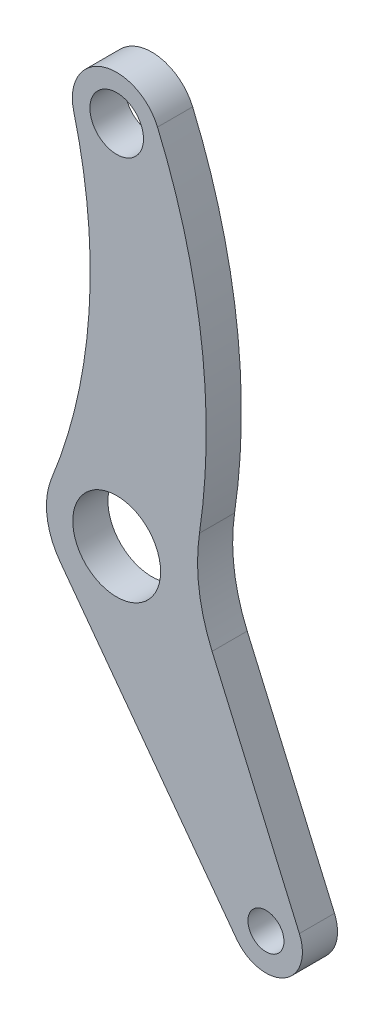
ISO-10303-21;
HEADER;
FILE_DESCRIPTION(('STEP AP214'),'2;1');
FILE_NAME('part.step','',(''),(''),'','','');
FILE_SCHEMA(('AUTOMOTIVE_DESIGN { 1 0 10303 214 1 1 1 1 }'));
ENDSEC;
DATA;
#1=APPLICATION_CONTEXT('core data for automotive mechanical design processes');
#2=APPLICATION_PROTOCOL_DEFINITION('international standard','automotive_design',2000,#1);
#3=PRODUCT_CONTEXT('',#1,'mechanical');
#4=PRODUCT('Part','Part','',(#3));
#5=PRODUCT_RELATED_PRODUCT_CATEGORY('part','',(#4));
#6=PRODUCT_DEFINITION_FORMATION('','',#4);
#7=PRODUCT_DEFINITION_CONTEXT('part definition',#1,'design');
#8=PRODUCT_DEFINITION('design','',#6,#7);
#9=PRODUCT_DEFINITION_SHAPE('','',#8);
#10=(LENGTH_UNIT() NAMED_UNIT(*) SI_UNIT(.MILLI.,.METRE.));
#11=(NAMED_UNIT(*) PLANE_ANGLE_UNIT() SI_UNIT($,.RADIAN.));
#12=(NAMED_UNIT(*) SI_UNIT($,.STERADIAN.) SOLID_ANGLE_UNIT());
#13=UNCERTAINTY_MEASURE_WITH_UNIT(LENGTH_MEASURE(1.E-05),#10,'distance_accuracy_value','');
#14=(GEOMETRIC_REPRESENTATION_CONTEXT(3) GLOBAL_UNCERTAINTY_ASSIGNED_CONTEXT((#13)) GLOBAL_UNIT_ASSIGNED_CONTEXT((#10,
#11,#12)) REPRESENTATION_CONTEXT('',''));
#15=CARTESIAN_POINT('',(0.,0.,0.));
#16=DIRECTION('',(0.,0.,1.));
#17=DIRECTION('',(1.,0.,0.));
#18=AXIS2_PLACEMENT_3D('',#15,#16,#17);
#19=CARTESIAN_POINT('',(0.,20.85,2.));
#20=DIRECTION('',(0.,0.,-1.));
#21=DIRECTION('',(-1.,0.,0.));
#22=AXIS2_PLACEMENT_3D('',#19,#20,#21);
#23=CYLINDRICAL_SURFACE('',#22,2.525);
#24=DIRECTION('',(0.,0.,1.));
#25=VECTOR('',#24,1.);
#26=CARTESIAN_POINT('',(2.32489384665101,21.8351363366582,-23.4515533866941));
#27=LINE('',#26,#25);
#28=CARTESIAN_POINT('',(2.32489384665101,21.8351363366582,0.));
#29=VERTEX_POINT('',#28);
#30=CARTESIAN_POINT('',(2.32489384665101,21.8351363366582,2.));
#31=VERTEX_POINT('',#30);
#32=EDGE_CURVE('E127',#29,#31,#27,.T.);
#33=ORIENTED_EDGE('',*,*,#32,.F.);
#34=CARTESIAN_POINT('',(0.,20.85,0.));
#35=DIRECTION('',(0.,0.,1.));
#36=DIRECTION('',(1.,0.,0.));
#37=AXIS2_PLACEMENT_3D('',#34,#35,#36);
#38=CIRCLE('',#37,2.525);
#39=CARTESIAN_POINT('',(-2.44600580844733,20.223357689713,0.));
#40=VERTEX_POINT('',#39);
#41=EDGE_CURVE('E116',#29,#40,#38,.T.);
#42=ORIENTED_EDGE('',*,*,#41,.T.);
#43=DIRECTION('',(0.,0.,1.));
#44=VECTOR('',#43,1.);
#45=CARTESIAN_POINT('',(-2.44600580844733,20.223357689713,-8.));
#46=LINE('',#45,#44);
#47=CARTESIAN_POINT('',(-2.44600580844733,20.223357689713,2.));
#48=VERTEX_POINT('',#47);
#49=EDGE_CURVE('E114',#40,#48,#46,.T.);
#50=ORIENTED_EDGE('',*,*,#49,.T.);
#51=CARTESIAN_POINT('',(0.,20.85,2.));
#52=DIRECTION('',(0.,0.,1.));
#53=DIRECTION('',(1.,0.,0.));
#54=AXIS2_PLACEMENT_3D('',#51,#52,#53);
#55=CIRCLE('',#54,2.525);
#56=EDGE_CURVE('E101',#31,#48,#55,.T.);
#57=ORIENTED_EDGE('',*,*,#56,.F.);
#58=EDGE_LOOP('',(#33,#42,#50,#57));
#59=FACE_BOUND('',#58,.T.);
#60=ADVANCED_FACE('F38',(#59),#23,.T.);
#61=CARTESIAN_POINT('',(0.,20.85,2.));
#62=DIRECTION('',(0.,0.,1.));
#63=DIRECTION('',(1.,0.,0.));
#64=AXIS2_PLACEMENT_3D('',#61,#62,#63);
#65=PLANE('',#64);
#66=DIRECTION('',(-0.398719458718008,0.917072948701257,0.));
#67=VECTOR('',#66,1.);
#68=CARTESIAN_POINT('',(3.94150323251723,0.966479061440609,2.));
#69=LINE('',#68,#67);
#70=CARTESIAN_POINT('',(10.402926368555,-13.8950889874956,2.));
#71=VERTEX_POINT('',#70);
#72=CARTESIAN_POINT('',(5.43288855448548,-2.46377523130135,2.));
#73=VERTEX_POINT('',#72);
#74=EDGE_CURVE('E156',#71,#73,#69,.T.);
#75=ORIENTED_EDGE('',*,*,#74,.T.);
#76=CARTESIAN_POINT('',(14.6036180414981,1.52341935587873,2.));
#77=DIRECTION('',(0.,0.,1.));
#78=DIRECTION('',(1.,0.,0.));
#79=AXIS2_PLACEMENT_3D('',#76,#77,#78);
#80=CIRCLE('',#79,10.);
#81=CARTESIAN_POINT('',(4.7136234782616,3.00261087125234,2.));
#82=VERTEX_POINT('',#81);
#83=EDGE_CURVE('E46',#73,#82,#80,.F.);
#84=ORIENTED_EDGE('',*,*,#83,.T.);
#85=CARTESIAN_POINT('',(-29.901357493066,8.17978117505995,2.));
#86=DIRECTION('',(0.,0.,1.));
#87=DIRECTION('',(-1.,0.,0.));
#88=AXIS2_PLACEMENT_3D('',#85,#86,#87);
#89=CIRCLE('',#88,35.);
#90=EDGE_CURVE('E107',#82,#31,#89,.T.);
#91=ORIENTED_EDGE('',*,*,#90,.T.);
#92=ORIENTED_EDGE('',*,*,#56,.T.);
#93=CARTESIAN_POINT('',(-31.5074609583167,12.7781025179856,2.));
#94=DIRECTION('',(0.,0.,1.));
#95=DIRECTION('',(-1.,0.,0.));
#96=AXIS2_PLACEMENT_3D('',#93,#94,#95);
#97=CIRCLE('',#96,30.);
#98=CARTESIAN_POINT('',(-3.70676011274314,1.50330617858654,2.));
#99=VERTEX_POINT('',#98);
#100=EDGE_CURVE('E106',#99,#48,#97,.T.);
#101=ORIENTED_EDGE('',*,*,#100,.F.);
#102=CARTESIAN_POINT('',(0.,0.,2.));
#103=DIRECTION('',(0.,0.,1.));
#104=DIRECTION('',(1.,0.,0.));
#105=AXIS2_PLACEMENT_3D('',#102,#103,#104);
#106=CIRCLE('',#105,4.);
#107=CARTESIAN_POINT('',(-3.21535061833445,-2.37939496535911,2.));
#108=VERTEX_POINT('',#107);
#109=EDGE_CURVE('E110',#99,#108,#106,.T.);
#110=ORIENTED_EDGE('',*,*,#109,.T.);
#111=DIRECTION('',(0.594848741339779,-0.803837654583611,0.));
#112=VECTOR('',#111,1.);
#113=CARTESIAN_POINT('',(-3.21535061833445,-2.37939496535911,2.));
#114=LINE('',#113,#112);
#115=CARTESIAN_POINT('',(6.83203686673892,-15.9567430026155,2.));
#116=VERTEX_POINT('',#115);
#117=EDGE_CURVE('E152',#108,#116,#114,.T.);
#118=ORIENTED_EDGE('',*,*,#117,.T.);
#119=CARTESIAN_POINT('',(8.49999999999991,-14.7224318643355,2.));
#120=DIRECTION('',(0.,0.,1.));
#121=DIRECTION('',(1.,0.,0.));
#122=AXIS2_PLACEMENT_3D('',#119,#120,#121);
#123=CIRCLE('',#122,2.075);
#124=EDGE_CURVE('E154',#116,#71,#123,.T.);
#125=ORIENTED_EDGE('',*,*,#124,.T.);
#126=EDGE_LOOP('',(#75,#84,#91,#92,#101,#110,#118,#125));
#127=FACE_BOUND('',#126,.T.);
#128=CARTESIAN_POINT('',(8.49999999999991,-14.7224318643355,2.));
#129=DIRECTION('',(0.,0.,1.));
#130=DIRECTION('',(1.,0.,0.));
#131=AXIS2_PLACEMENT_3D('',#128,#129,#130);
#132=CIRCLE('',#131,1.025);
#133=CARTESIAN_POINT('',(9.52499999999992,-14.7224318643355,2.));
#134=VERTEX_POINT('',#133);
#135=EDGE_CURVE('E140',#134,#134,#132,.T.);
#136=ORIENTED_EDGE('',*,*,#135,.F.);
#137=EDGE_LOOP('',(#136));
#138=FACE_BOUND('',#137,.T.);
#139=CARTESIAN_POINT('',(0.,20.85,2.));
#140=DIRECTION('',(0.,0.,1.));
#141=DIRECTION('',(1.,0.,0.));
#142=AXIS2_PLACEMENT_3D('',#139,#140,#141);
#143=CIRCLE('',#142,1.525);
#144=CARTESIAN_POINT('',(1.525,20.85,2.));
#145=VERTEX_POINT('',#144);
#146=EDGE_CURVE('E146',#145,#145,#143,.T.);
#147=ORIENTED_EDGE('',*,*,#146,.F.);
#148=EDGE_LOOP('',(#147));
#149=FACE_BOUND('',#148,.T.);
#150=CARTESIAN_POINT('',(0.,0.,2.));
#151=DIRECTION('',(0.,0.,1.));
#152=DIRECTION('',(1.,0.,0.));
#153=AXIS2_PLACEMENT_3D('',#150,#151,#152);
#154=CIRCLE('',#153,2.5);
#155=CARTESIAN_POINT('',(2.5,0.,2.));
#156=VERTEX_POINT('',#155);
#157=EDGE_CURVE('E134',#156,#156,#154,.T.);
#158=ORIENTED_EDGE('',*,*,#157,.F.);
#159=EDGE_LOOP('',(#158));
#160=FACE_BOUND('',#159,.T.);
#161=ADVANCED_FACE('F103',(#127,#138,#149,#160),#65,.T.);
#162=CARTESIAN_POINT('',(0.,20.85,0.));
#163=DIRECTION('',(0.,0.,1.));
#164=DIRECTION('',(1.,0.,0.));
#165=AXIS2_PLACEMENT_3D('',#162,#163,#164);
#166=PLANE('',#165);
#167=CARTESIAN_POINT('',(-29.901357493066,8.17978117505995,0.));
#168=DIRECTION('',(0.,0.,1.));
#169=DIRECTION('',(1.,0.,0.));
#170=AXIS2_PLACEMENT_3D('',#167,#168,#169);
#171=CIRCLE('',#170,35.);
#172=CARTESIAN_POINT('',(4.7136234782616,3.00261087125234,0.));
#173=VERTEX_POINT('',#172);
#174=EDGE_CURVE('E125',#29,#173,#171,.F.);
#175=ORIENTED_EDGE('',*,*,#174,.T.);
#176=CARTESIAN_POINT('',(14.6036180414981,1.52341935587873,0.));
#177=DIRECTION('',(0.,0.,1.));
#178=DIRECTION('',(1.,0.,0.));
#179=AXIS2_PLACEMENT_3D('',#176,#177,#178);
#180=CIRCLE('',#179,10.);
#181=CARTESIAN_POINT('',(5.43288855448548,-2.46377523130135,0.));
#182=VERTEX_POINT('',#181);
#183=EDGE_CURVE('E11',#173,#182,#180,.T.);
#184=ORIENTED_EDGE('',*,*,#183,.T.);
#185=DIRECTION('',(-0.398719458718008,0.917072948701257,0.));
#186=VECTOR('',#185,1.);
#187=CARTESIAN_POINT('',(3.94150323251723,0.966479061440609,0.));
#188=LINE('',#187,#186);
#189=CARTESIAN_POINT('',(10.402926368555,-13.8950889874956,0.));
#190=VERTEX_POINT('',#189);
#191=EDGE_CURVE('E111',#190,#182,#188,.T.);
#192=ORIENTED_EDGE('',*,*,#191,.F.);
#193=CARTESIAN_POINT('',(8.49999999999991,-14.7224318643355,0.));
#194=DIRECTION('',(0.,0.,1.));
#195=DIRECTION('',(1.,0.,0.));
#196=AXIS2_PLACEMENT_3D('',#193,#194,#195);
#197=CIRCLE('',#196,2.075);
#198=CARTESIAN_POINT('',(6.83203686673892,-15.9567430026155,0.));
#199=VERTEX_POINT('',#198);
#200=EDGE_CURVE('E164',#199,#190,#197,.T.);
#201=ORIENTED_EDGE('',*,*,#200,.F.);
#202=DIRECTION('',(0.594848741339779,-0.803837654583611,0.));
#203=VECTOR('',#202,1.);
#204=CARTESIAN_POINT('',(-3.21535061833445,-2.37939496535911,0.));
#205=LINE('',#204,#203);
#206=CARTESIAN_POINT('',(-3.21535061833445,-2.37939496535911,0.));
#207=VERTEX_POINT('',#206);
#208=EDGE_CURVE('E162',#207,#199,#205,.T.);
#209=ORIENTED_EDGE('',*,*,#208,.F.);
#210=CARTESIAN_POINT('',(0.,0.,0.));
#211=DIRECTION('',(0.,0.,1.));
#212=DIRECTION('',(1.,0.,0.));
#213=AXIS2_PLACEMENT_3D('',#210,#211,#212);
#214=CIRCLE('',#213,4.);
#215=CARTESIAN_POINT('',(-3.70676011274314,1.50330617858654,0.));
#216=VERTEX_POINT('',#215);
#217=EDGE_CURVE('E160',#216,#207,#214,.T.);
#218=ORIENTED_EDGE('',*,*,#217,.F.);
#219=CARTESIAN_POINT('',(-31.5074609583167,12.7781025179856,0.));
#220=DIRECTION('',(0.,0.,1.));
#221=DIRECTION('',(1.,0.,0.));
#222=AXIS2_PLACEMENT_3D('',#219,#220,#221);
#223=CIRCLE('',#222,30.);
#224=EDGE_CURVE('E176',#216,#40,#223,.T.);
#225=ORIENTED_EDGE('',*,*,#224,.T.);
#226=ORIENTED_EDGE('',*,*,#41,.F.);
#227=EDGE_LOOP('',(#175,#184,#192,#201,#209,#218,#225,#226));
#228=FACE_BOUND('',#227,.T.);
#229=CARTESIAN_POINT('',(0.,20.85,0.));
#230=DIRECTION('',(0.,0.,1.));
#231=DIRECTION('',(1.,0.,0.));
#232=AXIS2_PLACEMENT_3D('',#229,#230,#231);
#233=CIRCLE('',#232,1.525);
#234=CARTESIAN_POINT('',(1.525,20.85,0.));
#235=VERTEX_POINT('',#234);
#236=EDGE_CURVE('E143',#235,#235,#233,.T.);
#237=ORIENTED_EDGE('',*,*,#236,.T.);
#238=EDGE_LOOP('',(#237));
#239=FACE_BOUND('',#238,.T.);
#240=CARTESIAN_POINT('',(8.49999999999991,-14.7224318643355,0.));
#241=DIRECTION('',(0.,0.,1.));
#242=DIRECTION('',(1.,0.,0.));
#243=AXIS2_PLACEMENT_3D('',#240,#241,#242);
#244=CIRCLE('',#243,1.025);
#245=CARTESIAN_POINT('',(9.52499999999992,-14.7224318643355,0.));
#246=VERTEX_POINT('',#245);
#247=EDGE_CURVE('E137',#246,#246,#244,.T.);
#248=ORIENTED_EDGE('',*,*,#247,.T.);
#249=EDGE_LOOP('',(#248));
#250=FACE_BOUND('',#249,.T.);
#251=CARTESIAN_POINT('',(0.,0.,0.));
#252=DIRECTION('',(0.,0.,1.));
#253=DIRECTION('',(1.,0.,0.));
#254=AXIS2_PLACEMENT_3D('',#251,#252,#253);
#255=CIRCLE('',#254,2.5);
#256=CARTESIAN_POINT('',(2.5,0.,0.));
#257=VERTEX_POINT('',#256);
#258=EDGE_CURVE('E132',#257,#257,#255,.T.);
#259=ORIENTED_EDGE('',*,*,#258,.T.);
#260=EDGE_LOOP('',(#259));
#261=FACE_BOUND('',#260,.T.);
#262=ADVANCED_FACE('F196',(#228,#239,#250,#261),#166,.F.);
#263=CARTESIAN_POINT('',(0.,0.,2.));
#264=DIRECTION('',(0.,0.,-1.));
#265=DIRECTION('',(-1.,0.,0.));
#266=AXIS2_PLACEMENT_3D('',#263,#264,#265);
#267=CYLINDRICAL_SURFACE('',#266,4.);
#268=ORIENTED_EDGE('',*,*,#217,.T.);
#269=DIRECTION('',(0.,0.,-1.));
#270=VECTOR('',#269,1.);
#271=CARTESIAN_POINT('',(-3.21535061833445,-2.37939496535911,2.));
#272=LINE('',#271,#270);
#273=EDGE_CURVE('E173',#108,#207,#272,.T.);
#274=ORIENTED_EDGE('',*,*,#273,.F.);
#275=ORIENTED_EDGE('',*,*,#109,.F.);
#276=DIRECTION('',(0.,0.,1.));
#277=VECTOR('',#276,1.);
#278=CARTESIAN_POINT('',(-3.70676011274314,1.50330617858654,-8.));
#279=LINE('',#278,#277);
#280=EDGE_CURVE('E120',#216,#99,#279,.T.);
#281=ORIENTED_EDGE('',*,*,#280,.F.);
#282=EDGE_LOOP('',(#268,#274,#275,#281));
#283=FACE_BOUND('',#282,.T.);
#284=ADVANCED_FACE('F211',(#283),#267,.T.);
#285=CARTESIAN_POINT('',(-3.21535061833445,-2.37939496535911,2.));
#286=DIRECTION('',(0.803837654583611,0.594848741339779,0.));
#287=DIRECTION('',(-0.594848741339779,0.803837654583611,0.));
#288=AXIS2_PLACEMENT_3D('',#285,#286,#287);
#289=PLANE('',#288);
#290=ORIENTED_EDGE('',*,*,#208,.T.);
#291=DIRECTION('',(0.,0.,-1.));
#292=VECTOR('',#291,1.);
#293=CARTESIAN_POINT('',(6.83203686673892,-15.9567430026155,2.));
#294=LINE('',#293,#292);
#295=EDGE_CURVE('E170',#116,#199,#294,.T.);
#296=ORIENTED_EDGE('',*,*,#295,.F.);
#297=ORIENTED_EDGE('',*,*,#117,.F.);
#298=ORIENTED_EDGE('',*,*,#273,.T.);
#299=EDGE_LOOP('',(#290,#296,#297,#298));
#300=FACE_BOUND('',#299,.T.);
#301=ADVANCED_FACE('F214',(#300),#289,.F.);
#302=CARTESIAN_POINT('',(8.49999999999991,-14.7224318643355,2.));
#303=DIRECTION('',(0.,0.,-1.));
#304=DIRECTION('',(-1.,0.,0.));
#305=AXIS2_PLACEMENT_3D('',#302,#303,#304);
#306=CYLINDRICAL_SURFACE('',#305,2.075);
#307=ORIENTED_EDGE('',*,*,#200,.T.);
#308=DIRECTION('',(0.,0.,-1.));
#309=VECTOR('',#308,1.);
#310=CARTESIAN_POINT('',(10.402926368555,-13.8950889874956,2.));
#311=LINE('',#310,#309);
#312=EDGE_CURVE('E158',#71,#190,#311,.T.);
#313=ORIENTED_EDGE('',*,*,#312,.F.);
#314=ORIENTED_EDGE('',*,*,#124,.F.);
#315=ORIENTED_EDGE('',*,*,#295,.T.);
#316=EDGE_LOOP('',(#307,#313,#314,#315));
#317=FACE_BOUND('',#316,.T.);
#318=ADVANCED_FACE('F193',(#317),#306,.T.);
#319=CARTESIAN_POINT('',(3.94150323251723,0.966479061440609,2.));
#320=DIRECTION('',(-0.917072948701257,-0.398719458718008,0.));
#321=DIRECTION('',(0.398719458718008,-0.917072948701257,0.));
#322=AXIS2_PLACEMENT_3D('',#319,#320,#321);
#323=PLANE('',#322);
#324=ORIENTED_EDGE('',*,*,#191,.T.);
#325=DIRECTION('',(0.,0.,1.));
#326=VECTOR('',#325,1.);
#327=CARTESIAN_POINT('',(5.43288855448548,-2.46377523130135,2.));
#328=LINE('',#327,#326);
#329=EDGE_CURVE('E178',#182,#73,#328,.T.);
#330=ORIENTED_EDGE('',*,*,#329,.T.);
#331=ORIENTED_EDGE('',*,*,#74,.F.);
#332=ORIENTED_EDGE('',*,*,#312,.T.);
#333=EDGE_LOOP('',(#324,#330,#331,#332));
#334=FACE_BOUND('',#333,.T.);
#335=ADVANCED_FACE('F184',(#334),#323,.F.);
#336=CARTESIAN_POINT('',(0.,20.85,2.));
#337=DIRECTION('',(0.,0.,-1.));
#338=DIRECTION('',(-1.,0.,0.));
#339=AXIS2_PLACEMENT_3D('',#336,#337,#338);
#340=CYLINDRICAL_SURFACE('',#339,1.525);
#341=ORIENTED_EDGE('',*,*,#146,.T.);
#342=EDGE_LOOP('',(#341));
#343=FACE_BOUND('',#342,.T.);
#344=ORIENTED_EDGE('',*,*,#236,.F.);
#345=EDGE_LOOP('',(#344));
#346=FACE_BOUND('',#345,.T.);
#347=ADVANCED_FACE('F223',(#343,#346),#340,.F.);
#348=CARTESIAN_POINT('',(8.49999999999991,-14.7224318643355,2.));
#349=DIRECTION('',(0.,0.,-1.));
#350=DIRECTION('',(-1.,0.,0.));
#351=AXIS2_PLACEMENT_3D('',#348,#349,#350);
#352=CYLINDRICAL_SURFACE('',#351,1.025);
#353=ORIENTED_EDGE('',*,*,#135,.T.);
#354=EDGE_LOOP('',(#353));
#355=FACE_BOUND('',#354,.T.);
#356=ORIENTED_EDGE('',*,*,#247,.F.);
#357=EDGE_LOOP('',(#356));
#358=FACE_BOUND('',#357,.T.);
#359=ADVANCED_FACE('F228',(#355,#358),#352,.F.);
#360=CARTESIAN_POINT('',(0.,0.,2.));
#361=DIRECTION('',(0.,0.,-1.));
#362=DIRECTION('',(-1.,0.,0.));
#363=AXIS2_PLACEMENT_3D('',#360,#361,#362);
#364=CYLINDRICAL_SURFACE('',#363,2.5);
#365=ORIENTED_EDGE('',*,*,#157,.T.);
#366=EDGE_LOOP('',(#365));
#367=FACE_BOUND('',#366,.T.);
#368=ORIENTED_EDGE('',*,*,#258,.F.);
#369=EDGE_LOOP('',(#368));
#370=FACE_BOUND('',#369,.T.);
#371=ADVANCED_FACE('F232',(#367,#370),#364,.F.);
#372=CARTESIAN_POINT('',(-31.5074609583167,12.7781025179856,-8.));
#373=DIRECTION('',(0.,0.,1.));
#374=DIRECTION('',(1.,0.,0.));
#375=AXIS2_PLACEMENT_3D('',#372,#373,#374);
#376=CYLINDRICAL_SURFACE('',#375,30.);
#377=ORIENTED_EDGE('',*,*,#280,.T.);
#378=ORIENTED_EDGE('',*,*,#100,.T.);
#379=ORIENTED_EDGE('',*,*,#49,.F.);
#380=ORIENTED_EDGE('',*,*,#224,.F.);
#381=EDGE_LOOP('',(#377,#378,#379,#380));
#382=FACE_BOUND('',#381,.T.);
#383=ADVANCED_FACE('F123',(#382),#376,.F.);
#384=CARTESIAN_POINT('',(-29.901357493066,8.17978117505995,-23.4515533866941));
#385=DIRECTION('',(0.,0.,1.));
#386=DIRECTION('',(1.,0.,0.));
#387=AXIS2_PLACEMENT_3D('',#384,#385,#386);
#388=CYLINDRICAL_SURFACE('',#387,35.);
#389=ORIENTED_EDGE('',*,*,#90,.F.);
#390=DIRECTION('',(0.,0.,1.));
#391=VECTOR('',#390,1.);
#392=CARTESIAN_POINT('',(4.7136234782616,3.00261087125234,-23.4515533866941));
#393=LINE('',#392,#391);
#394=EDGE_CURVE('E59',#82,#173,#393,.F.);
#395=ORIENTED_EDGE('',*,*,#394,.T.);
#396=ORIENTED_EDGE('',*,*,#174,.F.);
#397=ORIENTED_EDGE('',*,*,#32,.T.);
#398=EDGE_LOOP('',(#389,#395,#396,#397));
#399=FACE_BOUND('',#398,.T.);
#400=ADVANCED_FACE('F200',(#399),#388,.T.);
#401=CARTESIAN_POINT('',(14.6036180414981,1.52341935587873,-23.4515533866941));
#402=DIRECTION('',(0.,0.,1.));
#403=DIRECTION('',(1.,0.,0.));
#404=AXIS2_PLACEMENT_3D('',#401,#402,#403);
#405=CYLINDRICAL_SURFACE('',#404,10.);
#406=ORIENTED_EDGE('',*,*,#183,.F.);
#407=ORIENTED_EDGE('',*,*,#394,.F.);
#408=ORIENTED_EDGE('',*,*,#83,.F.);
#409=ORIENTED_EDGE('',*,*,#329,.F.);
#410=EDGE_LOOP('',(#406,#407,#408,#409));
#411=FACE_BOUND('',#410,.T.);
#412=ADVANCED_FACE('F40',(#411),#405,.F.);
#413=CLOSED_SHELL('',(#60,#161,#262,#284,#301,#318,#335,#347,#359,#371,#383,#400,#412));
#414=MANIFOLD_SOLID_BREP('B2',#413);
#415=ADVANCED_BREP_SHAPE_REPRESENTATION('',(#18,#414),#14);
#416=SHAPE_DEFINITION_REPRESENTATION(#9,#415);
ENDSEC;
END-ISO-10303-21;
